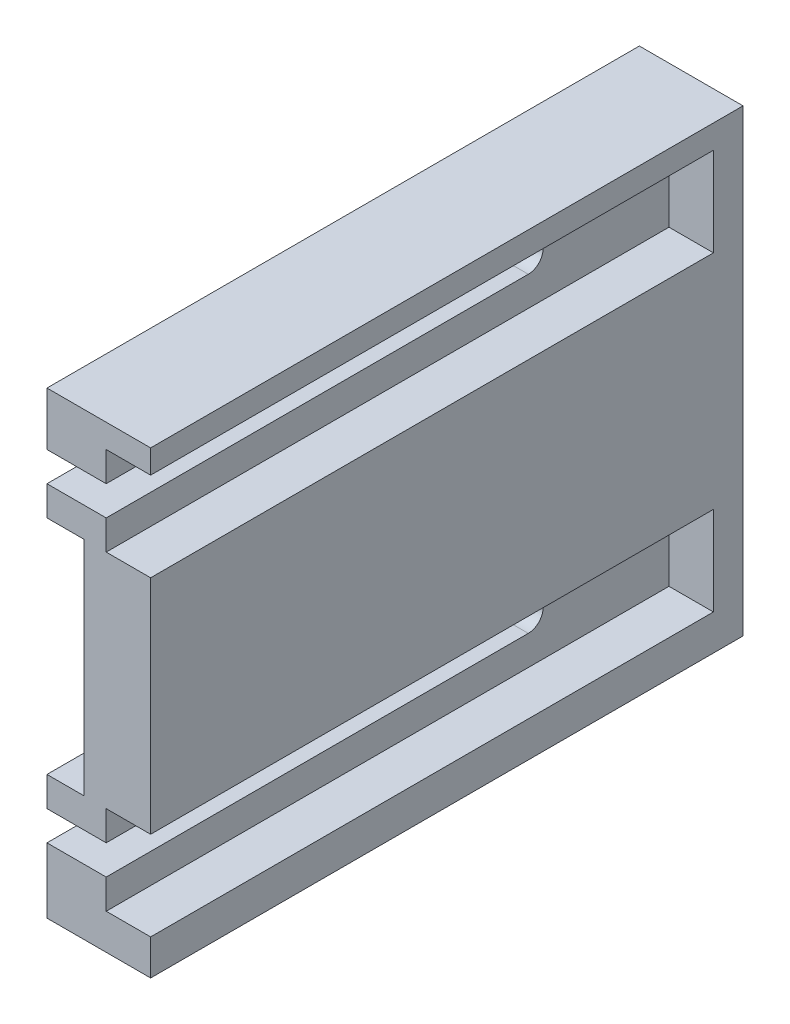
ISO-10303-21;
HEADER;
FILE_DESCRIPTION(('STEP AP214'),'2;1');
FILE_NAME('part.step','',(''),(''),'','','');
FILE_SCHEMA(('AUTOMOTIVE_DESIGN { 1 0 10303 214 1 1 1 1 }'));
ENDSEC;
DATA;
#1=APPLICATION_CONTEXT('core data for automotive mechanical design processes');
#2=APPLICATION_PROTOCOL_DEFINITION('international standard','automotive_design',2000,#1);
#3=PRODUCT_CONTEXT('',#1,'mechanical');
#4=PRODUCT('Part','Part','',(#3));
#5=PRODUCT_RELATED_PRODUCT_CATEGORY('part','',(#4));
#6=PRODUCT_DEFINITION_FORMATION('','',#4);
#7=PRODUCT_DEFINITION_CONTEXT('part definition',#1,'design');
#8=PRODUCT_DEFINITION('design','',#6,#7);
#9=PRODUCT_DEFINITION_SHAPE('','',#8);
#10=(LENGTH_UNIT() NAMED_UNIT(*) SI_UNIT(.MILLI.,.METRE.));
#11=(NAMED_UNIT(*) PLANE_ANGLE_UNIT() SI_UNIT($,.RADIAN.));
#12=(NAMED_UNIT(*) SI_UNIT($,.STERADIAN.) SOLID_ANGLE_UNIT());
#13=UNCERTAINTY_MEASURE_WITH_UNIT(LENGTH_MEASURE(1.E-05),#10,'distance_accuracy_value','');
#14=(GEOMETRIC_REPRESENTATION_CONTEXT(3) GLOBAL_UNCERTAINTY_ASSIGNED_CONTEXT((#13)) GLOBAL_UNIT_ASSIGNED_CONTEXT((#10,
#11,#12)) REPRESENTATION_CONTEXT('',''));
#15=CARTESIAN_POINT('',(0.,0.,0.));
#16=DIRECTION('',(0.,0.,1.));
#17=DIRECTION('',(1.,0.,0.));
#18=AXIS2_PLACEMENT_3D('',#15,#16,#17);
#19=CARTESIAN_POINT('',(63.5019503538707,16.4407505330005,73.3985296123953));
#20=DIRECTION('',(-1.,0.,0.));
#21=DIRECTION('',(0.,0.,1.));
#22=AXIS2_PLACEMENT_3D('',#19,#20,#21);
#23=PLANE('',#22);
#24=DIRECTION('',(0.,-1.,0.));
#25=VECTOR('',#24,1.);
#26=CARTESIAN_POINT('',(63.5019503538707,16.4407505330005,81.8985296123953));
#27=LINE('',#26,#25);
#28=CARTESIAN_POINT('',(63.5019503538707,37.4407505330005,81.8985296123953));
#29=VERTEX_POINT('',#28);
#30=CARTESIAN_POINT('',(63.5019503538707,22.4407505330005,81.8985296123953));
#31=VERTEX_POINT('',#30);
#32=EDGE_CURVE('E32',#29,#31,#27,.T.);
#33=ORIENTED_EDGE('',*,*,#32,.F.);
#34=DIRECTION('',(0.,0.,1.));
#35=VECTOR('',#34,1.);
#36=CARTESIAN_POINT('',(63.5019503538707,37.4407505330005,73.3985296123953));
#37=LINE('',#36,#35);
#38=CARTESIAN_POINT('',(63.5019503538707,37.4407505330002,111.398529612395));
#39=VERTEX_POINT('',#38);
#40=EDGE_CURVE('E274',#29,#39,#37,.T.);
#41=ORIENTED_EDGE('',*,*,#40,.T.);
#42=DIRECTION('',(0.,-1.,0.));
#43=VECTOR('',#42,1.);
#44=CARTESIAN_POINT('',(63.5019503538707,16.4407505329997,111.398529612395));
#45=LINE('',#44,#43);
#46=CARTESIAN_POINT('',(63.5019503538707,39.4407505330002,111.398529612395));
#47=VERTEX_POINT('',#46);
#48=EDGE_CURVE('E216',#47,#39,#45,.T.);
#49=ORIENTED_EDGE('',*,*,#48,.F.);
#50=DIRECTION('',(0.,0.,-1.));
#51=VECTOR('',#50,1.);
#52=CARTESIAN_POINT('',(63.5019503538707,39.4407505330005,73.3985296123953));
#53=LINE('',#52,#51);
#54=CARTESIAN_POINT('',(63.5019503538707,39.4407505330005,82.8985296123953));
#55=VERTEX_POINT('',#54);
#56=EDGE_CURVE('E345',#47,#55,#53,.T.);
#57=ORIENTED_EDGE('',*,*,#56,.T.);
#58=CARTESIAN_POINT('',(63.5019503538707,40.4407505330005,82.8985296123953));
#59=DIRECTION('',(-1.,0.,0.));
#60=DIRECTION('',(0.,0.,1.));
#61=AXIS2_PLACEMENT_3D('',#58,#59,#60);
#62=CIRCLE('',#61,1.);
#63=CARTESIAN_POINT('',(63.5019503538707,41.4407505330005,82.8985296123953));
#64=VERTEX_POINT('',#63);
#65=EDGE_CURVE('E348',#55,#64,#62,.F.);
#66=ORIENTED_EDGE('',*,*,#65,.T.);
#67=DIRECTION('',(0.,0.,-1.));
#68=VECTOR('',#67,1.);
#69=CARTESIAN_POINT('',(63.5019503538707,41.4407505330005,73.3985296123953));
#70=LINE('',#69,#68);
#71=CARTESIAN_POINT('',(63.5019503538707,41.4407505329999,111.398529612395));
#72=VERTEX_POINT('',#71);
#73=EDGE_CURVE('E351',#72,#64,#70,.T.);
#74=ORIENTED_EDGE('',*,*,#73,.F.);
#75=DIRECTION('',(0.,-1.,0.));
#76=VECTOR('',#75,1.);
#77=CARTESIAN_POINT('',(63.5019503538707,16.4407505329997,111.398529612395));
#78=LINE('',#77,#76);
#79=CARTESIAN_POINT('',(63.5019503538707,45.0368359832448,111.398529612395));
#80=VERTEX_POINT('',#79);
#81=EDGE_CURVE('E264',#80,#72,#78,.T.);
#82=ORIENTED_EDGE('',*,*,#81,.F.);
#83=DIRECTION('',(0.,0.,1.));
#84=VECTOR('',#83,1.);
#85=CARTESIAN_POINT('',(63.5019503538707,45.0368359832451,73.3985296123953));
#86=LINE('',#85,#84);
#87=CARTESIAN_POINT('',(63.5019503538707,45.0368359832451,71.3985296123953));
#88=VERTEX_POINT('',#87);
#89=EDGE_CURVE('E356',#88,#80,#86,.T.);
#90=ORIENTED_EDGE('',*,*,#89,.F.);
#91=DIRECTION('',(0.,1.,0.));
#92=VECTOR('',#91,1.);
#93=CARTESIAN_POINT('',(63.5019503538707,16.4407505330005,71.3985296123953));
#94=LINE('',#93,#92);
#95=CARTESIAN_POINT('',(63.5019503538707,14.0368359832451,71.3985296123953));
#96=VERTEX_POINT('',#95);
#97=EDGE_CURVE('E359',#96,#88,#94,.T.);
#98=ORIENTED_EDGE('',*,*,#97,.F.);
#99=DIRECTION('',(0.,0.,1.));
#100=VECTOR('',#99,1.);
#101=CARTESIAN_POINT('',(63.5019503538707,14.0368359832451,73.3985296123953));
#102=LINE('',#101,#100);
#103=CARTESIAN_POINT('',(63.5019503538707,14.0368359832448,111.398529612395));
#104=VERTEX_POINT('',#103);
#105=EDGE_CURVE('E354',#96,#104,#102,.T.);
#106=ORIENTED_EDGE('',*,*,#105,.T.);
#107=DIRECTION('',(0.,-1.,0.));
#108=VECTOR('',#107,1.);
#109=CARTESIAN_POINT('',(63.5019503538707,16.4407505329997,111.398529612395));
#110=LINE('',#109,#108);
#111=CARTESIAN_POINT('',(63.5019503538707,18.440750533,111.398529612395));
#112=VERTEX_POINT('',#111);
#113=EDGE_CURVE('E199',#112,#104,#110,.T.);
#114=ORIENTED_EDGE('',*,*,#113,.F.);
#115=DIRECTION('',(0.,0.,-1.));
#116=VECTOR('',#115,1.);
#117=CARTESIAN_POINT('',(63.5019503538707,18.4407505330005,73.3985296123953));
#118=LINE('',#117,#116);
#119=CARTESIAN_POINT('',(63.5019503538707,18.4407505330005,82.8985296123953));
#120=VERTEX_POINT('',#119);
#121=EDGE_CURVE('E195',#112,#120,#118,.T.);
#122=ORIENTED_EDGE('',*,*,#121,.T.);
#123=CARTESIAN_POINT('',(63.5019503538707,19.4407505330005,82.8985296123953));
#124=DIRECTION('',(-1.,0.,0.));
#125=DIRECTION('',(0.,0.,1.));
#126=AXIS2_PLACEMENT_3D('',#123,#124,#125);
#127=CIRCLE('',#126,1.);
#128=CARTESIAN_POINT('',(63.5019503538707,20.4407505330005,82.8985296123953));
#129=VERTEX_POINT('',#128);
#130=EDGE_CURVE('E343',#129,#120,#127,.T.);
#131=ORIENTED_EDGE('',*,*,#130,.F.);
#132=DIRECTION('',(0.,0.,-1.));
#133=VECTOR('',#132,1.);
#134=CARTESIAN_POINT('',(63.5019503538707,20.4407505330005,73.3985296123953));
#135=LINE('',#134,#133);
#136=CARTESIAN_POINT('',(63.5019503538707,20.4407505330002,111.398529612395));
#137=VERTEX_POINT('',#136);
#138=EDGE_CURVE('E337',#137,#129,#135,.T.);
#139=ORIENTED_EDGE('',*,*,#138,.F.);
#140=DIRECTION('',(0.,-1.,0.));
#141=VECTOR('',#140,1.);
#142=CARTESIAN_POINT('',(63.5019503538707,16.4407505329997,111.398529612395));
#143=LINE('',#142,#141);
#144=CARTESIAN_POINT('',(63.5019503538707,22.4407505330002,111.398529612395));
#145=VERTEX_POINT('',#144);
#146=EDGE_CURVE('E228',#145,#137,#143,.T.);
#147=ORIENTED_EDGE('',*,*,#146,.F.);
#148=DIRECTION('',(0.,0.,1.));
#149=VECTOR('',#148,1.);
#150=CARTESIAN_POINT('',(63.5019503538707,22.4407505330005,73.3985296123953));
#151=LINE('',#150,#149);
#152=EDGE_CURVE('E280',#31,#145,#151,.T.);
#153=ORIENTED_EDGE('',*,*,#152,.F.);
#154=EDGE_LOOP('',(#33,#41,#49,#57,#66,#74,#82,#90,#98,#106,#114,#122,#131,#139,#147,#153));
#155=FACE_BOUND('',#154,.T.);
#156=ADVANCED_FACE('F17',(#155),#23,.T.);
#157=CARTESIAN_POINT('',(70.5019503538707,16.4407505330005,73.3985296123953));
#158=DIRECTION('',(-1.,0.,0.));
#159=DIRECTION('',(0.,0.,1.));
#160=AXIS2_PLACEMENT_3D('',#157,#158,#159);
#161=PLANE('',#160);
#162=DIRECTION('',(0.,-1.,0.));
#163=VECTOR('',#162,1.);
#164=CARTESIAN_POINT('',(70.5019503538707,16.4407505330005,73.3985296123953));
#165=LINE('',#164,#163);
#166=CARTESIAN_POINT('',(70.5019503538707,43.4407505330005,73.3985296123953));
#167=VERTEX_POINT('',#166);
#168=CARTESIAN_POINT('',(70.5019503538707,37.4407505330005,73.3985296123953));
#169=VERTEX_POINT('',#168);
#170=EDGE_CURVE('E291',#167,#169,#165,.T.);
#171=ORIENTED_EDGE('',*,*,#170,.T.);
#172=DIRECTION('',(0.,0.,-1.));
#173=VECTOR('',#172,1.);
#174=CARTESIAN_POINT('',(70.5019503538707,37.4407505330005,73.3985296123953));
#175=LINE('',#174,#173);
#176=CARTESIAN_POINT('',(70.5019503538707,37.4407505330002,111.398529612395));
#177=VERTEX_POINT('',#176);
#178=EDGE_CURVE('E301',#177,#169,#175,.T.);
#179=ORIENTED_EDGE('',*,*,#178,.F.);
#180=DIRECTION('',(0.,1.,0.));
#181=VECTOR('',#180,1.);
#182=CARTESIAN_POINT('',(70.5019503538707,16.4407505329997,111.398529612395));
#183=LINE('',#182,#181);
#184=CARTESIAN_POINT('',(70.5019503538707,22.4407505330002,111.398529612395));
#185=VERTEX_POINT('',#184);
#186=EDGE_CURVE('E240',#185,#177,#183,.T.);
#187=ORIENTED_EDGE('',*,*,#186,.F.);
#188=DIRECTION('',(0.,0.,1.));
#189=VECTOR('',#188,1.);
#190=CARTESIAN_POINT('',(70.5019503538707,22.4407505330005,73.3985296123953));
#191=LINE('',#190,#189);
#192=CARTESIAN_POINT('',(70.5019503538707,22.4407505330005,73.3985296123953));
#193=VERTEX_POINT('',#192);
#194=EDGE_CURVE('E315',#193,#185,#191,.T.);
#195=ORIENTED_EDGE('',*,*,#194,.F.);
#196=DIRECTION('',(0.,1.,0.));
#197=VECTOR('',#196,1.);
#198=CARTESIAN_POINT('',(70.5019503538707,16.4407505330005,73.3985296123953));
#199=LINE('',#198,#197);
#200=CARTESIAN_POINT('',(70.5019503538707,16.4407505330005,73.3985296123953));
#201=VERTEX_POINT('',#200);
#202=EDGE_CURVE('E285',#201,#193,#199,.T.);
#203=ORIENTED_EDGE('',*,*,#202,.F.);
#204=DIRECTION('',(0.,0.,1.));
#205=VECTOR('',#204,1.);
#206=CARTESIAN_POINT('',(70.5019503538707,16.4407505330005,73.3985296123953));
#207=LINE('',#206,#205);
#208=CARTESIAN_POINT('',(70.5019503538707,16.4407505329997,111.398529612395));
#209=VERTEX_POINT('',#208);
#210=EDGE_CURVE('E325',#201,#209,#207,.T.);
#211=ORIENTED_EDGE('',*,*,#210,.T.);
#212=DIRECTION('',(0.,-1.,0.));
#213=VECTOR('',#212,1.);
#214=CARTESIAN_POINT('',(70.5019503538707,16.4407505329997,111.398529612395));
#215=LINE('',#214,#213);
#216=CARTESIAN_POINT('',(70.5019503538707,14.0368359832448,111.398529612395));
#217=VERTEX_POINT('',#216);
#218=EDGE_CURVE('E212',#209,#217,#215,.T.);
#219=ORIENTED_EDGE('',*,*,#218,.T.);
#220=DIRECTION('',(0.,0.,1.));
#221=VECTOR('',#220,1.);
#222=CARTESIAN_POINT('',(70.5019503538707,14.0368359832451,73.3985296123953));
#223=LINE('',#222,#221);
#224=CARTESIAN_POINT('',(70.5019503538707,14.0368359832451,71.3985296123953));
#225=VERTEX_POINT('',#224);
#226=EDGE_CURVE('E353',#225,#217,#223,.T.);
#227=ORIENTED_EDGE('',*,*,#226,.F.);
#228=DIRECTION('',(0.,1.,0.));
#229=VECTOR('',#228,1.);
#230=CARTESIAN_POINT('',(70.5019503538707,16.4407505330005,71.3985296123953));
#231=LINE('',#230,#229);
#232=CARTESIAN_POINT('',(70.5019503538707,45.0368359832451,71.3985296123953));
#233=VERTEX_POINT('',#232);
#234=EDGE_CURVE('E357',#225,#233,#231,.T.);
#235=ORIENTED_EDGE('',*,*,#234,.T.);
#236=DIRECTION('',(0.,0.,1.));
#237=VECTOR('',#236,1.);
#238=CARTESIAN_POINT('',(70.5019503538707,45.0368359832451,73.3985296123953));
#239=LINE('',#238,#237);
#240=CARTESIAN_POINT('',(70.5019503538707,45.0368359832448,111.398529612395));
#241=VERTEX_POINT('',#240);
#242=EDGE_CURVE('E363',#233,#241,#239,.T.);
#243=ORIENTED_EDGE('',*,*,#242,.T.);
#244=DIRECTION('',(0.,-1.,0.));
#245=VECTOR('',#244,1.);
#246=CARTESIAN_POINT('',(70.5019503538707,16.4407505329997,111.398529612395));
#247=LINE('',#246,#245);
#248=CARTESIAN_POINT('',(70.5019503538707,43.4407505330002,111.398529612395));
#249=VERTEX_POINT('',#248);
#250=EDGE_CURVE('E258',#241,#249,#247,.T.);
#251=ORIENTED_EDGE('',*,*,#250,.T.);
#252=DIRECTION('',(0.,0.,1.));
#253=VECTOR('',#252,1.);
#254=CARTESIAN_POINT('',(70.5019503538707,43.4407505330005,73.3985296123953));
#255=LINE('',#254,#253);
#256=EDGE_CURVE('E304',#167,#249,#255,.T.);
#257=ORIENTED_EDGE('',*,*,#256,.F.);
#258=EDGE_LOOP('',(#171,#179,#187,#195,#203,#211,#219,#227,#235,#243,#251,#257));
#259=FACE_BOUND('',#258,.T.);
#260=ADVANCED_FACE('F374',(#259),#161,.F.);
#261=CARTESIAN_POINT('',(63.5019503538707,14.0368359832451,73.3985296123953));
#262=DIRECTION('',(0.,1.,0.));
#263=DIRECTION('',(-1.,0.,0.));
#264=AXIS2_PLACEMENT_3D('',#261,#262,#263);
#265=PLANE('',#264);
#266=ORIENTED_EDGE('',*,*,#226,.T.);
#267=DIRECTION('',(1.,0.,0.));
#268=VECTOR('',#267,1.);
#269=CARTESIAN_POINT('',(70.5019503538707,14.0368359832448,111.398529612395));
#270=LINE('',#269,#268);
#271=EDGE_CURVE('E209',#104,#217,#270,.T.);
#272=ORIENTED_EDGE('',*,*,#271,.F.);
#273=ORIENTED_EDGE('',*,*,#105,.F.);
#274=DIRECTION('',(1.,0.,0.));
#275=VECTOR('',#274,1.);
#276=CARTESIAN_POINT('',(63.5019503538707,14.0368359832451,71.3985296123953));
#277=LINE('',#276,#275);
#278=EDGE_CURVE('E25',#96,#225,#277,.T.);
#279=ORIENTED_EDGE('',*,*,#278,.T.);
#280=EDGE_LOOP('',(#266,#272,#273,#279));
#281=FACE_BOUND('',#280,.T.);
#282=ADVANCED_FACE('F19',(#281),#265,.F.);
#283=CARTESIAN_POINT('',(63.5019503538707,45.0368359832451,73.3985296123953));
#284=DIRECTION('',(0.,1.,0.));
#285=DIRECTION('',(-1.,0.,0.));
#286=AXIS2_PLACEMENT_3D('',#283,#284,#285);
#287=PLANE('',#286);
#288=ORIENTED_EDGE('',*,*,#242,.F.);
#289=DIRECTION('',(1.,0.,0.));
#290=VECTOR('',#289,1.);
#291=CARTESIAN_POINT('',(63.5019503538707,45.0368359832451,71.3985296123953));
#292=LINE('',#291,#290);
#293=EDGE_CURVE('E11',#88,#233,#292,.T.);
#294=ORIENTED_EDGE('',*,*,#293,.F.);
#295=ORIENTED_EDGE('',*,*,#89,.T.);
#296=DIRECTION('',(1.,0.,0.));
#297=VECTOR('',#296,1.);
#298=CARTESIAN_POINT('',(70.5019503538707,45.0368359832448,111.398529612395));
#299=LINE('',#298,#297);
#300=EDGE_CURVE('E261',#80,#241,#299,.T.);
#301=ORIENTED_EDGE('',*,*,#300,.T.);
#302=EDGE_LOOP('',(#288,#294,#295,#301));
#303=FACE_BOUND('',#302,.T.);
#304=ADVANCED_FACE('F379',(#303),#287,.T.);
#305=CARTESIAN_POINT('',(63.5019503538707,16.4407505330005,71.3985296123953));
#306=DIRECTION('',(0.,0.,-1.));
#307=DIRECTION('',(-1.,0.,0.));
#308=AXIS2_PLACEMENT_3D('',#305,#306,#307);
#309=PLANE('',#308);
#310=ORIENTED_EDGE('',*,*,#234,.F.);
#311=ORIENTED_EDGE('',*,*,#278,.F.);
#312=ORIENTED_EDGE('',*,*,#97,.T.);
#313=ORIENTED_EDGE('',*,*,#293,.T.);
#314=EDGE_LOOP('',(#310,#311,#312,#313));
#315=FACE_BOUND('',#314,.T.);
#316=ADVANCED_FACE('F375',(#315),#309,.T.);
#317=CARTESIAN_POINT('',(56.5019503538707,19.4407505330005,82.8985296123953));
#318=DIRECTION('',(1.,0.,0.));
#319=DIRECTION('',(0.,0.,-1.));
#320=AXIS2_PLACEMENT_3D('',#317,#318,#319);
#321=CYLINDRICAL_SURFACE('',#320,1.);
#322=DIRECTION('',(1.,0.,0.));
#323=VECTOR('',#322,1.);
#324=CARTESIAN_POINT('',(56.5019503538707,18.4407505330005,82.8985296123953));
#325=LINE('',#324,#323);
#326=CARTESIAN_POINT('',(67.5019503538707,18.4407505330005,82.8985296123953));
#327=VERTEX_POINT('',#326);
#328=EDGE_CURVE('E334',#120,#327,#325,.T.);
#329=ORIENTED_EDGE('',*,*,#328,.T.);
#330=CARTESIAN_POINT('',(67.5019503538707,19.4407505330005,82.8985296123953));
#331=DIRECTION('',(-1.,0.,0.));
#332=DIRECTION('',(0.,0.,1.));
#333=AXIS2_PLACEMENT_3D('',#330,#331,#332);
#334=CIRCLE('',#333,1.);
#335=CARTESIAN_POINT('',(67.5019503538707,20.4407505330005,82.8985296123953));
#336=VERTEX_POINT('',#335);
#337=EDGE_CURVE('E185',#327,#336,#334,.F.);
#338=ORIENTED_EDGE('',*,*,#337,.T.);
#339=DIRECTION('',(1.,0.,0.));
#340=VECTOR('',#339,1.);
#341=CARTESIAN_POINT('',(56.5019503538707,20.4407505330005,82.8985296123953));
#342=LINE('',#341,#340);
#343=EDGE_CURVE('E312',#129,#336,#342,.T.);
#344=ORIENTED_EDGE('',*,*,#343,.F.);
#345=ORIENTED_EDGE('',*,*,#130,.T.);
#346=EDGE_LOOP('',(#329,#338,#344,#345));
#347=FACE_BOUND('',#346,.T.);
#348=ADVANCED_FACE('F433',(#347),#321,.F.);
#349=CARTESIAN_POINT('',(56.5019503538707,18.4407505330005,73.3985296123953));
#350=DIRECTION('',(0.,1.,0.));
#351=DIRECTION('',(-1.,0.,0.));
#352=AXIS2_PLACEMENT_3D('',#349,#350,#351);
#353=PLANE('',#352);
#354=DIRECTION('',(0.,0.,1.));
#355=VECTOR('',#354,1.);
#356=CARTESIAN_POINT('',(67.5019503538707,18.4407505330005,73.3985296123953));
#357=LINE('',#356,#355);
#358=CARTESIAN_POINT('',(67.5019503538707,18.4407505330002,111.398529612395));
#359=VERTEX_POINT('',#358);
#360=EDGE_CURVE('E177',#327,#359,#357,.T.);
#361=ORIENTED_EDGE('',*,*,#360,.F.);
#362=ORIENTED_EDGE('',*,*,#328,.F.);
#363=ORIENTED_EDGE('',*,*,#121,.F.);
#364=DIRECTION('',(-1.,0.,0.));
#365=VECTOR('',#364,1.);
#366=CARTESIAN_POINT('',(70.5019503538706,18.4407505330004,111.398529612395));
#367=LINE('',#366,#365);
#368=EDGE_CURVE('E192',#359,#112,#367,.T.);
#369=ORIENTED_EDGE('',*,*,#368,.F.);
#370=EDGE_LOOP('',(#361,#362,#363,#369));
#371=FACE_BOUND('',#370,.T.);
#372=ADVANCED_FACE('F193',(#371),#353,.T.);
#373=CARTESIAN_POINT('',(56.5019503538707,20.4407505330005,73.3985296123953));
#374=DIRECTION('',(0.,1.,0.));
#375=DIRECTION('',(-1.,0.,0.));
#376=AXIS2_PLACEMENT_3D('',#373,#374,#375);
#377=PLANE('',#376);
#378=ORIENTED_EDGE('',*,*,#343,.T.);
#379=DIRECTION('',(0.,0.,1.));
#380=VECTOR('',#379,1.);
#381=CARTESIAN_POINT('',(67.5019503538707,20.4407505330005,73.3985296123953));
#382=LINE('',#381,#380);
#383=CARTESIAN_POINT('',(67.5019503538707,20.4407505330002,111.398529612395));
#384=VERTEX_POINT('',#383);
#385=EDGE_CURVE('E318',#336,#384,#382,.T.);
#386=ORIENTED_EDGE('',*,*,#385,.T.);
#387=DIRECTION('',(1.,0.,0.));
#388=VECTOR('',#387,1.);
#389=CARTESIAN_POINT('',(70.5019503538707,20.4407505330002,111.398529612395));
#390=LINE('',#389,#388);
#391=EDGE_CURVE('E231',#137,#384,#390,.T.);
#392=ORIENTED_EDGE('',*,*,#391,.F.);
#393=ORIENTED_EDGE('',*,*,#138,.T.);
#394=EDGE_LOOP('',(#378,#386,#392,#393));
#395=FACE_BOUND('',#394,.T.);
#396=ADVANCED_FACE('F431',(#395),#377,.F.);
#397=CARTESIAN_POINT('',(56.5019503538707,41.4407505330005,73.3985296123953));
#398=DIRECTION('',(0.,1.,0.));
#399=DIRECTION('',(-1.,0.,0.));
#400=AXIS2_PLACEMENT_3D('',#397,#398,#399);
#401=PLANE('',#400);
#402=DIRECTION('',(1.,0.,0.));
#403=VECTOR('',#402,1.);
#404=CARTESIAN_POINT('',(56.5019503538707,41.4407505330005,82.8985296123953));
#405=LINE('',#404,#403);
#406=CARTESIAN_POINT('',(67.5019503538707,41.4407505330005,82.8985296123953));
#407=VERTEX_POINT('',#406);
#408=EDGE_CURVE('E333',#64,#407,#405,.T.);
#409=ORIENTED_EDGE('',*,*,#408,.T.);
#410=DIRECTION('',(0.,0.,1.));
#411=VECTOR('',#410,1.);
#412=CARTESIAN_POINT('',(67.5019503538707,41.4407505330005,73.3985296123953));
#413=LINE('',#412,#411);
#414=CARTESIAN_POINT('',(67.5019503538707,41.4407505329999,111.398529612395));
#415=VERTEX_POINT('',#414);
#416=EDGE_CURVE('E294',#407,#415,#413,.T.);
#417=ORIENTED_EDGE('',*,*,#416,.T.);
#418=DIRECTION('',(1.,0.,0.));
#419=VECTOR('',#418,1.);
#420=CARTESIAN_POINT('',(70.5019503538707,41.4407505329999,111.398529612395));
#421=LINE('',#420,#419);
#422=EDGE_CURVE('E267',#72,#415,#421,.T.);
#423=ORIENTED_EDGE('',*,*,#422,.F.);
#424=ORIENTED_EDGE('',*,*,#73,.T.);
#425=EDGE_LOOP('',(#409,#417,#423,#424));
#426=FACE_BOUND('',#425,.T.);
#427=ADVANCED_FACE('F436',(#426),#401,.F.);
#428=CARTESIAN_POINT('',(56.5019503538707,40.4407505330005,82.8985296123953));
#429=DIRECTION('',(1.,0.,0.));
#430=DIRECTION('',(0.,0.,-1.));
#431=AXIS2_PLACEMENT_3D('',#428,#429,#430);
#432=CYLINDRICAL_SURFACE('',#431,1.);
#433=CARTESIAN_POINT('',(67.5019503538707,40.4407505330005,82.8985296123953));
#434=DIRECTION('',(-1.,0.,0.));
#435=DIRECTION('',(0.,0.,1.));
#436=AXIS2_PLACEMENT_3D('',#433,#434,#435);
#437=CIRCLE('',#436,1.);
#438=CARTESIAN_POINT('',(67.5019503538707,39.4407505330005,82.8985296123953));
#439=VERTEX_POINT('',#438);
#440=EDGE_CURVE('E40',#407,#439,#437,.T.);
#441=ORIENTED_EDGE('',*,*,#440,.F.);
#442=ORIENTED_EDGE('',*,*,#408,.F.);
#443=ORIENTED_EDGE('',*,*,#65,.F.);
#444=DIRECTION('',(1.,0.,0.));
#445=VECTOR('',#444,1.);
#446=CARTESIAN_POINT('',(56.5019503538707,39.4407505330005,82.8985296123953));
#447=LINE('',#446,#445);
#448=EDGE_CURVE('E330',#55,#439,#447,.T.);
#449=ORIENTED_EDGE('',*,*,#448,.T.);
#450=EDGE_LOOP('',(#441,#442,#443,#449));
#451=FACE_BOUND('',#450,.T.);
#452=ADVANCED_FACE('F408',(#451),#432,.F.);
#453=CARTESIAN_POINT('',(56.5019503538707,39.4407505330005,73.3985296123953));
#454=DIRECTION('',(0.,1.,0.));
#455=DIRECTION('',(-1.,0.,0.));
#456=AXIS2_PLACEMENT_3D('',#453,#454,#455);
#457=PLANE('',#456);
#458=DIRECTION('',(0.,0.,1.));
#459=VECTOR('',#458,1.);
#460=CARTESIAN_POINT('',(67.5019503538707,39.4407505330005,73.3985296123953));
#461=LINE('',#460,#459);
#462=CARTESIAN_POINT('',(67.5019503538707,39.4407505330002,111.398529612395));
#463=VERTEX_POINT('',#462);
#464=EDGE_CURVE('E290',#439,#463,#461,.T.);
#465=ORIENTED_EDGE('',*,*,#464,.F.);
#466=ORIENTED_EDGE('',*,*,#448,.F.);
#467=ORIENTED_EDGE('',*,*,#56,.F.);
#468=DIRECTION('',(-1.,0.,0.));
#469=VECTOR('',#468,1.);
#470=CARTESIAN_POINT('',(70.5019503538707,39.4407505330002,111.398529612395));
#471=LINE('',#470,#469);
#472=EDGE_CURVE('E249',#463,#47,#471,.T.);
#473=ORIENTED_EDGE('',*,*,#472,.F.);
#474=EDGE_LOOP('',(#465,#466,#467,#473));
#475=FACE_BOUND('',#474,.T.);
#476=ADVANCED_FACE('F406',(#475),#457,.T.);
#477=CARTESIAN_POINT('',(67.5019503538707,37.4407505330005,73.3985296123953));
#478=DIRECTION('',(0.,-1.,0.));
#479=DIRECTION('',(0.,0.,1.));
#480=AXIS2_PLACEMENT_3D('',#477,#478,#479);
#481=PLANE('',#480);
#482=ORIENTED_EDGE('',*,*,#178,.T.);
#483=DIRECTION('',(1.,0.,0.));
#484=VECTOR('',#483,1.);
#485=CARTESIAN_POINT('',(67.5019503538707,37.4407505330005,73.3985296123953));
#486=LINE('',#485,#484);
#487=CARTESIAN_POINT('',(67.5019503538707,37.4407505330005,73.3985296123953));
#488=VERTEX_POINT('',#487);
#489=EDGE_CURVE('E300',#488,#169,#486,.T.);
#490=ORIENTED_EDGE('',*,*,#489,.F.);
#491=DIRECTION('',(0.,0.,-1.));
#492=VECTOR('',#491,1.);
#493=CARTESIAN_POINT('',(67.5019503538707,37.4407505330005,73.3985296123953));
#494=LINE('',#493,#492);
#495=CARTESIAN_POINT('',(67.5019503538707,37.4407505330002,111.398529612395));
#496=VERTEX_POINT('',#495);
#497=EDGE_CURVE('E287',#496,#488,#494,.T.);
#498=ORIENTED_EDGE('',*,*,#497,.F.);
#499=DIRECTION('',(-1.,0.,0.));
#500=VECTOR('',#499,1.);
#501=CARTESIAN_POINT('',(70.5019503538707,37.4407505330002,111.398529612395));
#502=LINE('',#501,#500);
#503=EDGE_CURVE('E243',#177,#496,#502,.T.);
#504=ORIENTED_EDGE('',*,*,#503,.F.);
#505=EDGE_LOOP('',(#482,#490,#498,#504));
#506=FACE_BOUND('',#505,.T.);
#507=ADVANCED_FACE('F398',(#506),#481,.F.);
#508=CARTESIAN_POINT('',(67.5019503538707,43.4407505330005,73.3985296123953));
#509=DIRECTION('',(0.,1.,0.));
#510=DIRECTION('',(-1.,0.,0.));
#511=AXIS2_PLACEMENT_3D('',#508,#509,#510);
#512=PLANE('',#511);
#513=ORIENTED_EDGE('',*,*,#256,.T.);
#514=DIRECTION('',(1.,0.,0.));
#515=VECTOR('',#514,1.);
#516=CARTESIAN_POINT('',(70.5019503538707,43.4407505330002,111.398529612395));
#517=LINE('',#516,#515);
#518=CARTESIAN_POINT('',(67.5019503538707,43.4407505330002,111.398529612395));
#519=VERTEX_POINT('',#518);
#520=EDGE_CURVE('E255',#519,#249,#517,.T.);
#521=ORIENTED_EDGE('',*,*,#520,.F.);
#522=DIRECTION('',(0.,0.,1.));
#523=VECTOR('',#522,1.);
#524=CARTESIAN_POINT('',(67.5019503538707,43.4407505330005,73.3985296123953));
#525=LINE('',#524,#523);
#526=CARTESIAN_POINT('',(67.5019503538707,43.4407505330005,73.3985296123953));
#527=VERTEX_POINT('',#526);
#528=EDGE_CURVE('E296',#527,#519,#525,.T.);
#529=ORIENTED_EDGE('',*,*,#528,.F.);
#530=DIRECTION('',(1.,0.,0.));
#531=VECTOR('',#530,1.);
#532=CARTESIAN_POINT('',(67.5019503538707,43.4407505330005,73.3985296123953));
#533=LINE('',#532,#531);
#534=EDGE_CURVE('E310',#527,#167,#533,.T.);
#535=ORIENTED_EDGE('',*,*,#534,.T.);
#536=EDGE_LOOP('',(#513,#521,#529,#535));
#537=FACE_BOUND('',#536,.T.);
#538=ADVANCED_FACE('F389',(#537),#512,.F.);
#539=CARTESIAN_POINT('',(67.5019503538707,16.4407505330005,73.3985296123953));
#540=DIRECTION('',(0.,0.,1.));
#541=DIRECTION('',(0.,1.,0.));
#542=AXIS2_PLACEMENT_3D('',#539,#540,#541);
#543=PLANE('',#542);
#544=ORIENTED_EDGE('',*,*,#170,.F.);
#545=ORIENTED_EDGE('',*,*,#534,.F.);
#546=DIRECTION('',(0.,-1.,0.));
#547=VECTOR('',#546,1.);
#548=CARTESIAN_POINT('',(67.5019503538707,16.4407505330005,73.3985296123953));
#549=LINE('',#548,#547);
#550=EDGE_CURVE('E298',#527,#488,#549,.T.);
#551=ORIENTED_EDGE('',*,*,#550,.T.);
#552=ORIENTED_EDGE('',*,*,#489,.T.);
#553=EDGE_LOOP('',(#544,#545,#551,#552));
#554=FACE_BOUND('',#553,.T.);
#555=ADVANCED_FACE('F393',(#554),#543,.T.);
#556=CARTESIAN_POINT('',(67.5019503538707,16.4407505330005,73.3985296123953));
#557=DIRECTION('',(-1.,0.,0.));
#558=DIRECTION('',(0.,0.,1.));
#559=AXIS2_PLACEMENT_3D('',#556,#557,#558);
#560=PLANE('',#559);
#561=ORIENTED_EDGE('',*,*,#497,.T.);
#562=ORIENTED_EDGE('',*,*,#550,.F.);
#563=ORIENTED_EDGE('',*,*,#528,.T.);
#564=DIRECTION('',(0.,1.,0.));
#565=VECTOR('',#564,1.);
#566=CARTESIAN_POINT('',(67.5019503538707,16.4407505329997,111.398529612395));
#567=LINE('',#566,#565);
#568=EDGE_CURVE('E252',#415,#519,#567,.T.);
#569=ORIENTED_EDGE('',*,*,#568,.F.);
#570=ORIENTED_EDGE('',*,*,#416,.F.);
#571=ORIENTED_EDGE('',*,*,#440,.T.);
#572=ORIENTED_EDGE('',*,*,#464,.T.);
#573=DIRECTION('',(0.,1.,0.));
#574=VECTOR('',#573,1.);
#575=CARTESIAN_POINT('',(67.5019503538707,16.4407505329997,111.398529612395));
#576=LINE('',#575,#574);
#577=EDGE_CURVE('E246',#496,#463,#576,.T.);
#578=ORIENTED_EDGE('',*,*,#577,.F.);
#579=EDGE_LOOP('',(#561,#562,#563,#569,#570,#571,#572,#578));
#580=FACE_BOUND('',#579,.T.);
#581=ADVANCED_FACE('F403',(#580),#560,.F.);
#582=CARTESIAN_POINT('',(67.5019503538707,16.4407505330005,73.3985296123953));
#583=DIRECTION('',(0.,0.,-1.));
#584=DIRECTION('',(-1.,0.,0.));
#585=AXIS2_PLACEMENT_3D('',#582,#583,#584);
#586=PLANE('',#585);
#587=ORIENTED_EDGE('',*,*,#202,.T.);
#588=DIRECTION('',(1.,0.,0.));
#589=VECTOR('',#588,1.);
#590=CARTESIAN_POINT('',(67.5019503538707,22.4407505330005,73.3985296123953));
#591=LINE('',#590,#589);
#592=CARTESIAN_POINT('',(67.5019503538707,22.4407505330005,73.3985296123953));
#593=VERTEX_POINT('',#592);
#594=EDGE_CURVE('E322',#593,#193,#591,.T.);
#595=ORIENTED_EDGE('',*,*,#594,.F.);
#596=DIRECTION('',(0.,1.,0.));
#597=VECTOR('',#596,1.);
#598=CARTESIAN_POINT('',(67.5019503538707,16.4407505330005,73.3985296123953));
#599=LINE('',#598,#597);
#600=CARTESIAN_POINT('',(67.5019503538707,16.4407505330005,73.3985296123953));
#601=VERTEX_POINT('',#600);
#602=EDGE_CURVE('E313',#601,#593,#599,.T.);
#603=ORIENTED_EDGE('',*,*,#602,.F.);
#604=DIRECTION('',(1.,0.,0.));
#605=VECTOR('',#604,1.);
#606=CARTESIAN_POINT('',(67.5019503538707,16.4407505330005,73.3985296123953));
#607=LINE('',#606,#605);
#608=EDGE_CURVE('E305',#601,#201,#607,.T.);
#609=ORIENTED_EDGE('',*,*,#608,.T.);
#610=EDGE_LOOP('',(#587,#595,#603,#609));
#611=FACE_BOUND('',#610,.T.);
#612=ADVANCED_FACE('F552',(#611),#586,.F.);
#613=CARTESIAN_POINT('',(67.5019503538707,16.4407505330005,73.3985296123953));
#614=DIRECTION('',(0.,1.,0.));
#615=DIRECTION('',(-1.,0.,0.));
#616=AXIS2_PLACEMENT_3D('',#613,#614,#615);
#617=PLANE('',#616);
#618=ORIENTED_EDGE('',*,*,#210,.F.);
#619=ORIENTED_EDGE('',*,*,#608,.F.);
#620=DIRECTION('',(0.,0.,1.));
#621=VECTOR('',#620,1.);
#622=CARTESIAN_POINT('',(67.5019503538707,16.4407505330005,73.3985296123953));
#623=LINE('',#622,#621);
#624=CARTESIAN_POINT('',(67.5019503538707,16.4407505329992,111.398529612395));
#625=VERTEX_POINT('',#624);
#626=EDGE_CURVE('E189',#601,#625,#623,.T.);
#627=ORIENTED_EDGE('',*,*,#626,.T.);
#628=DIRECTION('',(-1.,-1.53678589093903E-13,0.));
#629=VECTOR('',#628,1.);
#630=CARTESIAN_POINT('',(70.5019503538707,16.4407505329997,111.398529612395));
#631=LINE('',#630,#629);
#632=EDGE_CURVE('E205',#209,#625,#631,.T.);
#633=ORIENTED_EDGE('',*,*,#632,.F.);
#634=EDGE_LOOP('',(#618,#619,#627,#633));
#635=FACE_BOUND('',#634,.T.);
#636=ADVANCED_FACE('F560',(#635),#617,.T.);
#637=CARTESIAN_POINT('',(67.5019503538707,22.4407505330005,73.3985296123953));
#638=DIRECTION('',(0.,1.,0.));
#639=DIRECTION('',(-1.,0.,0.));
#640=AXIS2_PLACEMENT_3D('',#637,#638,#639);
#641=PLANE('',#640);
#642=ORIENTED_EDGE('',*,*,#194,.T.);
#643=DIRECTION('',(1.,0.,0.));
#644=VECTOR('',#643,1.);
#645=CARTESIAN_POINT('',(70.5019503538707,22.4407505330002,111.398529612395));
#646=LINE('',#645,#644);
#647=CARTESIAN_POINT('',(67.5019503538707,22.4407505330002,111.398529612395));
#648=VERTEX_POINT('',#647);
#649=EDGE_CURVE('E237',#648,#185,#646,.T.);
#650=ORIENTED_EDGE('',*,*,#649,.F.);
#651=DIRECTION('',(0.,0.,1.));
#652=VECTOR('',#651,1.);
#653=CARTESIAN_POINT('',(67.5019503538707,22.4407505330005,73.3985296123953));
#654=LINE('',#653,#652);
#655=EDGE_CURVE('E320',#593,#648,#654,.T.);
#656=ORIENTED_EDGE('',*,*,#655,.F.);
#657=ORIENTED_EDGE('',*,*,#594,.T.);
#658=EDGE_LOOP('',(#642,#650,#656,#657));
#659=FACE_BOUND('',#658,.T.);
#660=ADVANCED_FACE('F569',(#659),#641,.F.);
#661=CARTESIAN_POINT('',(67.5019503538707,16.4407505330005,73.3985296123953));
#662=DIRECTION('',(-1.,0.,0.));
#663=DIRECTION('',(0.,0.,1.));
#664=AXIS2_PLACEMENT_3D('',#661,#662,#663);
#665=PLANE('',#664);
#666=ORIENTED_EDGE('',*,*,#602,.T.);
#667=ORIENTED_EDGE('',*,*,#655,.T.);
#668=DIRECTION('',(0.,1.,0.));
#669=VECTOR('',#668,1.);
#670=CARTESIAN_POINT('',(67.5019503538707,16.4407505329997,111.398529612395));
#671=LINE('',#670,#669);
#672=EDGE_CURVE('E234',#384,#648,#671,.T.);
#673=ORIENTED_EDGE('',*,*,#672,.F.);
#674=ORIENTED_EDGE('',*,*,#385,.F.);
#675=ORIENTED_EDGE('',*,*,#337,.F.);
#676=ORIENTED_EDGE('',*,*,#360,.T.);
#677=DIRECTION('',(0.,1.,0.));
#678=VECTOR('',#677,1.);
#679=CARTESIAN_POINT('',(67.5019503538707,16.4407505329997,111.398529612395));
#680=LINE('',#679,#678);
#681=EDGE_CURVE('E183',#625,#359,#680,.T.);
#682=ORIENTED_EDGE('',*,*,#681,.F.);
#683=ORIENTED_EDGE('',*,*,#626,.F.);
#684=EDGE_LOOP('',(#666,#667,#673,#674,#675,#676,#682,#683));
#685=FACE_BOUND('',#684,.T.);
#686=ADVANCED_FACE('F180',(#685),#665,.F.);
#687=CARTESIAN_POINT('',(66.0019503538707,16.4407505330005,81.8985296123953));
#688=DIRECTION('',(0.,0.,-1.));
#689=DIRECTION('',(0.,-1.,0.));
#690=AXIS2_PLACEMENT_3D('',#687,#688,#689);
#691=PLANE('',#690);
#692=ORIENTED_EDGE('',*,*,#32,.T.);
#693=DIRECTION('',(-1.,0.,0.));
#694=VECTOR('',#693,1.);
#695=CARTESIAN_POINT('',(66.0019503538707,22.4407505330005,81.8985296123953));
#696=LINE('',#695,#694);
#697=CARTESIAN_POINT('',(66.0019503538707,22.4407505330005,81.8985296123953));
#698=VERTEX_POINT('',#697);
#699=EDGE_CURVE('E278',#698,#31,#696,.T.);
#700=ORIENTED_EDGE('',*,*,#699,.F.);
#701=DIRECTION('',(0.,-1.,0.));
#702=VECTOR('',#701,1.);
#703=CARTESIAN_POINT('',(66.0019503538707,16.4407505330005,81.8985296123953));
#704=LINE('',#703,#702);
#705=CARTESIAN_POINT('',(66.0019503538707,37.4407505330005,81.8985296123953));
#706=VERTEX_POINT('',#705);
#707=EDGE_CURVE('E270',#706,#698,#704,.T.);
#708=ORIENTED_EDGE('',*,*,#707,.F.);
#709=DIRECTION('',(-1.,0.,0.));
#710=VECTOR('',#709,1.);
#711=CARTESIAN_POINT('',(66.0019503538707,37.4407505330005,81.8985296123953));
#712=LINE('',#711,#710);
#713=EDGE_CURVE('E283',#706,#29,#712,.T.);
#714=ORIENTED_EDGE('',*,*,#713,.T.);
#715=EDGE_LOOP('',(#692,#700,#708,#714));
#716=FACE_BOUND('',#715,.T.);
#717=ADVANCED_FACE('F586',(#716),#691,.F.);
#718=CARTESIAN_POINT('',(66.0019503538707,37.4407505330005,73.3985296123953));
#719=DIRECTION('',(0.,-1.,0.));
#720=DIRECTION('',(1.,0.,0.));
#721=AXIS2_PLACEMENT_3D('',#718,#719,#720);
#722=PLANE('',#721);
#723=ORIENTED_EDGE('',*,*,#40,.F.);
#724=ORIENTED_EDGE('',*,*,#713,.F.);
#725=DIRECTION('',(0.,0.,1.));
#726=VECTOR('',#725,1.);
#727=CARTESIAN_POINT('',(66.0019503538707,37.4407505330005,73.3985296123953));
#728=LINE('',#727,#726);
#729=CARTESIAN_POINT('',(66.0019503538707,37.4407505330002,111.398529612395));
#730=VERTEX_POINT('',#729);
#731=EDGE_CURVE('E276',#706,#730,#728,.T.);
#732=ORIENTED_EDGE('',*,*,#731,.T.);
#733=DIRECTION('',(1.,0.,0.));
#734=VECTOR('',#733,1.);
#735=CARTESIAN_POINT('',(70.5019503538707,37.4407505330002,111.398529612395));
#736=LINE('',#735,#734);
#737=EDGE_CURVE('E219',#39,#730,#736,.T.);
#738=ORIENTED_EDGE('',*,*,#737,.F.);
#739=EDGE_LOOP('',(#723,#724,#732,#738));
#740=FACE_BOUND('',#739,.T.);
#741=ADVANCED_FACE('F594',(#740),#722,.T.);
#742=CARTESIAN_POINT('',(66.0019503538707,22.4407505330005,73.3985296123953));
#743=DIRECTION('',(0.,-1.,0.));
#744=DIRECTION('',(1.,0.,0.));
#745=AXIS2_PLACEMENT_3D('',#742,#743,#744);
#746=PLANE('',#745);
#747=ORIENTED_EDGE('',*,*,#152,.T.);
#748=DIRECTION('',(-1.,0.,0.));
#749=VECTOR('',#748,1.);
#750=CARTESIAN_POINT('',(70.5019503538707,22.4407505330002,111.398529612395));
#751=LINE('',#750,#749);
#752=CARTESIAN_POINT('',(66.0019503538707,22.4407505330002,111.398529612395));
#753=VERTEX_POINT('',#752);
#754=EDGE_CURVE('E225',#753,#145,#751,.T.);
#755=ORIENTED_EDGE('',*,*,#754,.F.);
#756=DIRECTION('',(0.,0.,1.));
#757=VECTOR('',#756,1.);
#758=CARTESIAN_POINT('',(66.0019503538707,22.4407505330005,73.3985296123953));
#759=LINE('',#758,#757);
#760=EDGE_CURVE('E273',#698,#753,#759,.T.);
#761=ORIENTED_EDGE('',*,*,#760,.F.);
#762=ORIENTED_EDGE('',*,*,#699,.T.);
#763=EDGE_LOOP('',(#747,#755,#761,#762));
#764=FACE_BOUND('',#763,.T.);
#765=ADVANCED_FACE('F424',(#764),#746,.F.);
#766=CARTESIAN_POINT('',(66.0019503538707,16.4407505330005,73.3985296123953));
#767=DIRECTION('',(-1.,0.,0.));
#768=DIRECTION('',(0.,0.,1.));
#769=AXIS2_PLACEMENT_3D('',#766,#767,#768);
#770=PLANE('',#769);
#771=ORIENTED_EDGE('',*,*,#707,.T.);
#772=ORIENTED_EDGE('',*,*,#760,.T.);
#773=DIRECTION('',(0.,-1.,0.));
#774=VECTOR('',#773,1.);
#775=CARTESIAN_POINT('',(66.0019503538707,16.4407505329997,111.398529612395));
#776=LINE('',#775,#774);
#777=EDGE_CURVE('E222',#730,#753,#776,.T.);
#778=ORIENTED_EDGE('',*,*,#777,.F.);
#779=ORIENTED_EDGE('',*,*,#731,.F.);
#780=EDGE_LOOP('',(#771,#772,#778,#779));
#781=FACE_BOUND('',#780,.T.);
#782=ADVANCED_FACE('F420',(#781),#770,.T.);
#783=CARTESIAN_POINT('',(70.5019503538707,16.4407505329997,111.398529612395));
#784=DIRECTION('',(0.,0.,1.));
#785=DIRECTION('',(0.,1.,0.));
#786=AXIS2_PLACEMENT_3D('',#783,#784,#785);
#787=PLANE('',#786);
#788=ORIENTED_EDGE('',*,*,#568,.T.);
#789=ORIENTED_EDGE('',*,*,#520,.T.);
#790=ORIENTED_EDGE('',*,*,#250,.F.);
#791=ORIENTED_EDGE('',*,*,#300,.F.);
#792=ORIENTED_EDGE('',*,*,#81,.T.);
#793=ORIENTED_EDGE('',*,*,#422,.T.);
#794=EDGE_LOOP('',(#788,#789,#790,#791,#792,#793));
#795=FACE_BOUND('',#794,.T.);
#796=ADVANCED_FACE('F384',(#795),#787,.T.);
#797=CARTESIAN_POINT('',(70.5019503538707,16.4407505329997,111.398529612395));
#798=DIRECTION('',(0.,0.,1.));
#799=DIRECTION('',(0.,1.,0.));
#800=AXIS2_PLACEMENT_3D('',#797,#798,#799);
#801=PLANE('',#800);
#802=ORIENTED_EDGE('',*,*,#48,.T.);
#803=ORIENTED_EDGE('',*,*,#737,.T.);
#804=ORIENTED_EDGE('',*,*,#777,.T.);
#805=ORIENTED_EDGE('',*,*,#754,.T.);
#806=ORIENTED_EDGE('',*,*,#146,.T.);
#807=ORIENTED_EDGE('',*,*,#391,.T.);
#808=ORIENTED_EDGE('',*,*,#672,.T.);
#809=ORIENTED_EDGE('',*,*,#649,.T.);
#810=ORIENTED_EDGE('',*,*,#186,.T.);
#811=ORIENTED_EDGE('',*,*,#503,.T.);
#812=ORIENTED_EDGE('',*,*,#577,.T.);
#813=ORIENTED_EDGE('',*,*,#472,.T.);
#814=EDGE_LOOP('',(#802,#803,#804,#805,#806,#807,#808,#809,#810,#811,#812,#813));
#815=FACE_BOUND('',#814,.T.);
#816=ADVANCED_FACE('F401',(#815),#801,.T.);
#817=CARTESIAN_POINT('',(70.5019503538707,16.4407505329997,111.398529612395));
#818=DIRECTION('',(0.,0.,1.));
#819=DIRECTION('',(0.,1.,0.));
#820=AXIS2_PLACEMENT_3D('',#817,#818,#819);
#821=PLANE('',#820);
#822=ORIENTED_EDGE('',*,*,#681,.T.);
#823=ORIENTED_EDGE('',*,*,#368,.T.);
#824=ORIENTED_EDGE('',*,*,#113,.T.);
#825=ORIENTED_EDGE('',*,*,#271,.T.);
#826=ORIENTED_EDGE('',*,*,#218,.F.);
#827=ORIENTED_EDGE('',*,*,#632,.T.);
#828=EDGE_LOOP('',(#822,#823,#824,#825,#826,#827));
#829=FACE_BOUND('',#828,.T.);
#830=ADVANCED_FACE('F202',(#829),#821,.T.);
#831=CLOSED_SHELL('',(#156,#260,#282,#304,#316,#348,#372,#396,#427,#452,#476,#507,#538,#555,
#581,#612,#636,#660,#686,#717,#741,#765,#782,#796,#816,#830));
#832=MANIFOLD_SOLID_BREP('B1',#831);
#833=ADVANCED_BREP_SHAPE_REPRESENTATION('',(#18,#832),#14);
#834=SHAPE_DEFINITION_REPRESENTATION(#9,#833);
ENDSEC;
END-ISO-10303-21;
